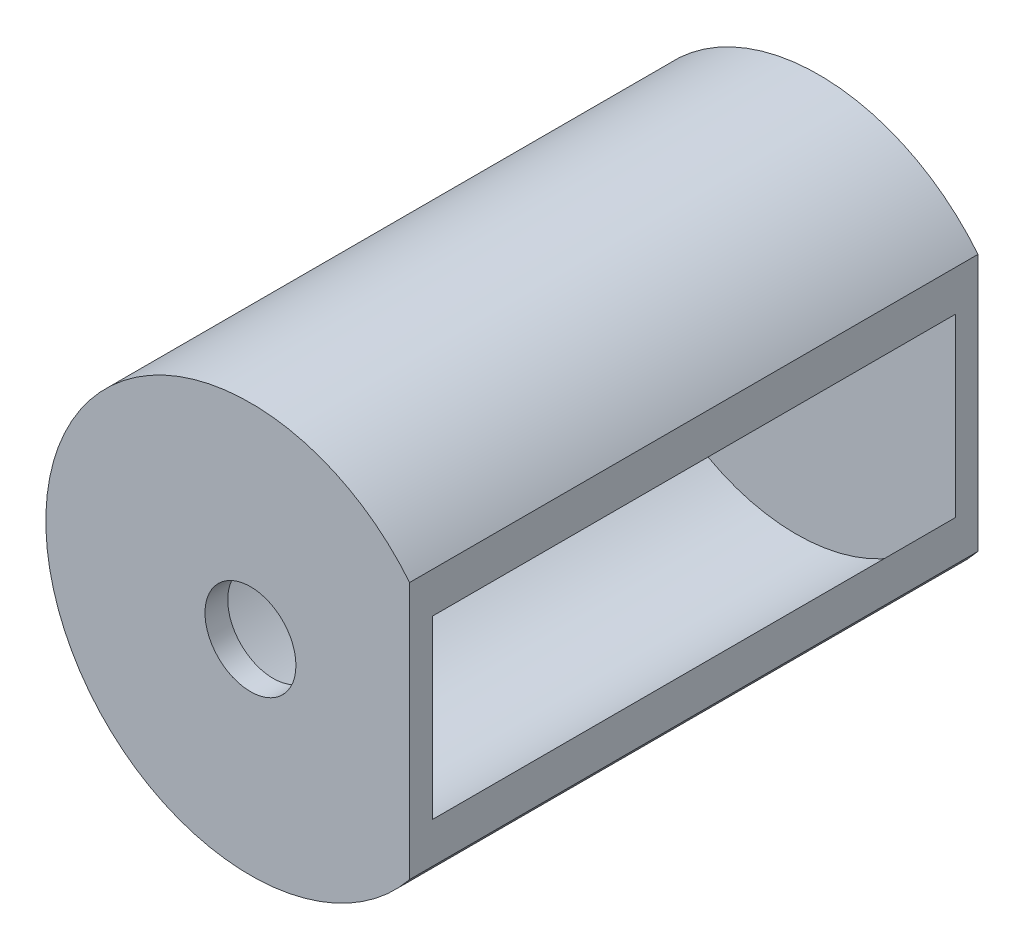
ISO-10303-21;
HEADER;
FILE_DESCRIPTION(('STEP AP214'),'2;1');
FILE_NAME('part.step','',(''),(''),'','','');
FILE_SCHEMA(('AUTOMOTIVE_DESIGN { 1 0 10303 214 1 1 1 1 }'));
ENDSEC;
DATA;
#1=APPLICATION_CONTEXT('core data for automotive mechanical design processes');
#2=APPLICATION_PROTOCOL_DEFINITION('international standard','automotive_design',2000,#1);
#3=PRODUCT_CONTEXT('',#1,'mechanical');
#4=PRODUCT('Part','Part','',(#3));
#5=PRODUCT_RELATED_PRODUCT_CATEGORY('part','',(#4));
#6=PRODUCT_DEFINITION_FORMATION('','',#4);
#7=PRODUCT_DEFINITION_CONTEXT('part definition',#1,'design');
#8=PRODUCT_DEFINITION('design','',#6,#7);
#9=PRODUCT_DEFINITION_SHAPE('','',#8);
#10=(LENGTH_UNIT() NAMED_UNIT(*) SI_UNIT(.MILLI.,.METRE.));
#11=(NAMED_UNIT(*) PLANE_ANGLE_UNIT() SI_UNIT($,.RADIAN.));
#12=(NAMED_UNIT(*) SI_UNIT($,.STERADIAN.) SOLID_ANGLE_UNIT());
#13=UNCERTAINTY_MEASURE_WITH_UNIT(LENGTH_MEASURE(1.E-05),#10,'distance_accuracy_value','');
#14=(GEOMETRIC_REPRESENTATION_CONTEXT(3) GLOBAL_UNCERTAINTY_ASSIGNED_CONTEXT((#13)) GLOBAL_UNIT_ASSIGNED_CONTEXT((#10,
#11,#12)) REPRESENTATION_CONTEXT('',''));
#15=CARTESIAN_POINT('',(0.,0.,0.));
#16=DIRECTION('',(0.,0.,1.));
#17=DIRECTION('',(1.,0.,0.));
#18=AXIS2_PLACEMENT_3D('',#15,#16,#17);
#19=CARTESIAN_POINT('',(0.,0.,50.));
#20=DIRECTION('',(0.,0.,1.));
#21=DIRECTION('',(1.,0.,0.));
#22=AXIS2_PLACEMENT_3D('',#19,#20,#21);
#23=PLANE('',#22);
#24=CARTESIAN_POINT('',(0.,0.,50.));
#25=DIRECTION('',(0.,0.,1.));
#26=DIRECTION('',(1.,0.,0.));
#27=AXIS2_PLACEMENT_3D('',#24,#25,#26);
#28=CIRCLE('',#27,4.);
#29=CARTESIAN_POINT('',(4.,0.,50.));
#30=VERTEX_POINT('',#29);
#31=EDGE_CURVE('E98',#30,#30,#28,.T.);
#32=ORIENTED_EDGE('',*,*,#31,.F.);
#33=EDGE_LOOP('',(#32));
#34=FACE_BOUND('',#33,.T.);
#35=DIRECTION('',(0.,-1.,0.));
#36=VECTOR('',#35,1.);
#37=CARTESIAN_POINT('',(14.,18.,50.));
#38=LINE('',#37,#36);
#39=CARTESIAN_POINT('',(14.,11.3137084989848,50.));
#40=VERTEX_POINT('',#39);
#41=CARTESIAN_POINT('',(14.,-11.3137084989848,50.));
#42=VERTEX_POINT('',#41);
#43=EDGE_CURVE('E60',#40,#42,#38,.T.);
#44=ORIENTED_EDGE('',*,*,#43,.F.);
#45=CARTESIAN_POINT('',(0.,0.,50.));
#46=DIRECTION('',(0.,0.,1.));
#47=DIRECTION('',(1.,0.,0.));
#48=AXIS2_PLACEMENT_3D('',#45,#46,#47);
#49=CIRCLE('',#48,18.);
#50=EDGE_CURVE('E53',#40,#42,#49,.T.);
#51=ORIENTED_EDGE('',*,*,#50,.T.);
#52=EDGE_LOOP('',(#44,#51));
#53=FACE_BOUND('',#52,.T.);
#54=ADVANCED_FACE('F44',(#34,#53),#23,.T.);
#55=CARTESIAN_POINT('',(0.,0.,0.));
#56=DIRECTION('',(0.,0.,1.));
#57=DIRECTION('',(1.,0.,0.));
#58=AXIS2_PLACEMENT_3D('',#55,#56,#57);
#59=PLANE('',#58);
#60=CARTESIAN_POINT('',(0.,0.,0.));
#61=DIRECTION('',(0.,0.,1.));
#62=DIRECTION('',(1.,0.,0.));
#63=AXIS2_PLACEMENT_3D('',#60,#61,#62);
#64=CIRCLE('',#63,4.);
#65=CARTESIAN_POINT('',(4.,0.,0.));
#66=VERTEX_POINT('',#65);
#67=EDGE_CURVE('E121',#66,#66,#64,.T.);
#68=ORIENTED_EDGE('',*,*,#67,.T.);
#69=EDGE_LOOP('',(#68));
#70=FACE_BOUND('',#69,.T.);
#71=CARTESIAN_POINT('',(0.,0.,0.));
#72=DIRECTION('',(0.,0.,1.));
#73=DIRECTION('',(1.,0.,0.));
#74=AXIS2_PLACEMENT_3D('',#71,#72,#73);
#75=CIRCLE('',#74,18.);
#76=CARTESIAN_POINT('',(14.,11.3137084989848,0.));
#77=VERTEX_POINT('',#76);
#78=CARTESIAN_POINT('',(14.,-11.3137084989848,0.));
#79=VERTEX_POINT('',#78);
#80=EDGE_CURVE('E97',#77,#79,#75,.T.);
#81=ORIENTED_EDGE('',*,*,#80,.F.);
#82=DIRECTION('',(0.,1.,0.));
#83=VECTOR('',#82,1.);
#84=CARTESIAN_POINT('',(14.,18.,0.));
#85=LINE('',#84,#83);
#86=EDGE_CURVE('E85',#79,#77,#85,.T.);
#87=ORIENTED_EDGE('',*,*,#86,.F.);
#88=EDGE_LOOP('',(#81,#87));
#89=FACE_BOUND('',#88,.T.);
#90=ADVANCED_FACE('F96',(#70,#89),#59,.F.);
#91=CARTESIAN_POINT('',(0.,0.,50.));
#92=DIRECTION('',(0.,0.,-1.));
#93=DIRECTION('',(-1.,0.,0.));
#94=AXIS2_PLACEMENT_3D('',#91,#92,#93);
#95=CYLINDRICAL_SURFACE('',#94,18.);
#96=ORIENTED_EDGE('',*,*,#50,.F.);
#97=DIRECTION('',(0.,0.,-1.));
#98=VECTOR('',#97,1.);
#99=CARTESIAN_POINT('',(14.,11.3137084989848,50.));
#100=LINE('',#99,#98);
#101=EDGE_CURVE('E91',#40,#77,#100,.T.);
#102=ORIENTED_EDGE('',*,*,#101,.T.);
#103=ORIENTED_EDGE('',*,*,#80,.T.);
#104=DIRECTION('',(0.,0.,-1.));
#105=VECTOR('',#104,1.);
#106=CARTESIAN_POINT('',(14.,-11.3137084989848,50.));
#107=LINE('',#106,#105);
#108=EDGE_CURVE('E82',#79,#42,#107,.F.);
#109=ORIENTED_EDGE('',*,*,#108,.T.);
#110=EDGE_LOOP('',(#96,#102,#103,#109));
#111=FACE_BOUND('',#110,.T.);
#112=ADVANCED_FACE('F46',(#111),#95,.T.);
#113=CARTESIAN_POINT('',(14.,0.,0.));
#114=DIRECTION('',(-1.,0.,0.));
#115=DIRECTION('',(0.,0.,1.));
#116=AXIS2_PLACEMENT_3D('',#113,#114,#115);
#117=PLANE('',#116);
#118=DIRECTION('',(0.,0.,-1.));
#119=VECTOR('',#118,1.);
#120=CARTESIAN_POINT('',(14.,-7.74596669241483,50.));
#121=LINE('',#120,#119);
#122=CARTESIAN_POINT('',(14.,-7.74596669241483,2.));
#123=VERTEX_POINT('',#122);
#124=CARTESIAN_POINT('',(14.,-7.74596669241483,48.));
#125=VERTEX_POINT('',#124);
#126=EDGE_CURVE('E68',#123,#125,#121,.F.);
#127=ORIENTED_EDGE('',*,*,#126,.T.);
#128=DIRECTION('',(0.,-1.,0.));
#129=VECTOR('',#128,1.);
#130=CARTESIAN_POINT('',(14.,0.,48.));
#131=LINE('',#130,#129);
#132=CARTESIAN_POINT('',(14.,7.74596669241483,48.));
#133=VERTEX_POINT('',#132);
#134=EDGE_CURVE('E13',#133,#125,#131,.T.);
#135=ORIENTED_EDGE('',*,*,#134,.F.);
#136=DIRECTION('',(0.,0.,-1.));
#137=VECTOR('',#136,1.);
#138=CARTESIAN_POINT('',(14.,7.74596669241483,50.));
#139=LINE('',#138,#137);
#140=CARTESIAN_POINT('',(14.,7.74596669241483,2.));
#141=VERTEX_POINT('',#140);
#142=EDGE_CURVE('E112',#133,#141,#139,.T.);
#143=ORIENTED_EDGE('',*,*,#142,.T.);
#144=DIRECTION('',(0.,1.,0.));
#145=VECTOR('',#144,1.);
#146=CARTESIAN_POINT('',(14.,0.,2.));
#147=LINE('',#146,#145);
#148=EDGE_CURVE('E92',#123,#141,#147,.T.);
#149=ORIENTED_EDGE('',*,*,#148,.F.);
#150=EDGE_LOOP('',(#127,#135,#143,#149));
#151=FACE_BOUND('',#150,.T.);
#152=ORIENTED_EDGE('',*,*,#43,.T.);
#153=ORIENTED_EDGE('',*,*,#108,.F.);
#154=ORIENTED_EDGE('',*,*,#86,.T.);
#155=ORIENTED_EDGE('',*,*,#101,.F.);
#156=EDGE_LOOP('',(#152,#153,#154,#155));
#157=FACE_BOUND('',#156,.T.);
#158=ADVANCED_FACE('F84',(#151,#157),#117,.F.);
#159=CARTESIAN_POINT('',(0.,0.,2.));
#160=DIRECTION('',(0.,0.,-1.));
#161=DIRECTION('',(-1.,0.,0.));
#162=AXIS2_PLACEMENT_3D('',#159,#160,#161);
#163=PLANE('',#162);
#164=CARTESIAN_POINT('',(0.,0.,2.));
#165=DIRECTION('',(0.,0.,-1.));
#166=DIRECTION('',(-1.,0.,0.));
#167=AXIS2_PLACEMENT_3D('',#164,#165,#166);
#168=CIRCLE('',#167,4.);
#169=CARTESIAN_POINT('',(-4.,0.,2.));
#170=VERTEX_POINT('',#169);
#171=EDGE_CURVE('E118',#170,#170,#168,.T.);
#172=ORIENTED_EDGE('',*,*,#171,.T.);
#173=EDGE_LOOP('',(#172));
#174=FACE_BOUND('',#173,.T.);
#175=CARTESIAN_POINT('',(0.,0.,2.));
#176=DIRECTION('',(0.,0.,-1.));
#177=DIRECTION('',(-1.,0.,0.));
#178=AXIS2_PLACEMENT_3D('',#175,#176,#177);
#179=CIRCLE('',#178,16.);
#180=EDGE_CURVE('E100',#123,#141,#179,.T.);
#181=ORIENTED_EDGE('',*,*,#180,.F.);
#182=ORIENTED_EDGE('',*,*,#148,.T.);
#183=EDGE_LOOP('',(#181,#182));
#184=FACE_BOUND('',#183,.T.);
#185=ADVANCED_FACE('F157',(#174,#184),#163,.F.);
#186=CARTESIAN_POINT('',(0.,0.,50.));
#187=DIRECTION('',(0.,0.,-1.));
#188=DIRECTION('',(-1.,0.,0.));
#189=AXIS2_PLACEMENT_3D('',#186,#187,#188);
#190=CYLINDRICAL_SURFACE('',#189,16.);
#191=ORIENTED_EDGE('',*,*,#142,.F.);
#192=CARTESIAN_POINT('',(0.,0.,48.));
#193=DIRECTION('',(0.,0.,1.));
#194=DIRECTION('',(1.,0.,0.));
#195=AXIS2_PLACEMENT_3D('',#192,#193,#194);
#196=CIRCLE('',#195,16.);
#197=EDGE_CURVE('E104',#133,#125,#196,.T.);
#198=ORIENTED_EDGE('',*,*,#197,.T.);
#199=ORIENTED_EDGE('',*,*,#126,.F.);
#200=ORIENTED_EDGE('',*,*,#180,.T.);
#201=EDGE_LOOP('',(#191,#198,#199,#200));
#202=FACE_BOUND('',#201,.T.);
#203=ADVANCED_FACE('F142',(#202),#190,.F.);
#204=CARTESIAN_POINT('',(0.,0.,48.));
#205=DIRECTION('',(0.,0.,1.));
#206=DIRECTION('',(1.,0.,0.));
#207=AXIS2_PLACEMENT_3D('',#204,#205,#206);
#208=PLANE('',#207);
#209=CARTESIAN_POINT('',(0.,0.,48.));
#210=DIRECTION('',(0.,0.,1.));
#211=DIRECTION('',(1.,0.,0.));
#212=AXIS2_PLACEMENT_3D('',#209,#210,#211);
#213=CIRCLE('',#212,4.);
#214=CARTESIAN_POINT('',(4.,0.,48.));
#215=VERTEX_POINT('',#214);
#216=EDGE_CURVE('E48',#215,#215,#213,.T.);
#217=ORIENTED_EDGE('',*,*,#216,.T.);
#218=EDGE_LOOP('',(#217));
#219=FACE_BOUND('',#218,.T.);
#220=ORIENTED_EDGE('',*,*,#197,.F.);
#221=ORIENTED_EDGE('',*,*,#134,.T.);
#222=EDGE_LOOP('',(#220,#221));
#223=FACE_BOUND('',#222,.T.);
#224=ADVANCED_FACE('F128',(#219,#223),#208,.F.);
#225=CARTESIAN_POINT('',(0.,0.,0.));
#226=DIRECTION('',(0.,0.,1.));
#227=DIRECTION('',(1.,0.,0.));
#228=AXIS2_PLACEMENT_3D('',#225,#226,#227);
#229=CYLINDRICAL_SURFACE('',#228,4.);
#230=ORIENTED_EDGE('',*,*,#31,.T.);
#231=EDGE_LOOP('',(#230));
#232=FACE_BOUND('',#231,.T.);
#233=ORIENTED_EDGE('',*,*,#216,.F.);
#234=EDGE_LOOP('',(#233));
#235=FACE_BOUND('',#234,.T.);
#236=ADVANCED_FACE('F131',(#232,#235),#229,.F.);
#237=ORIENTED_EDGE('',*,*,#67,.F.);
#238=EDGE_LOOP('',(#237));
#239=FACE_BOUND('',#238,.T.);
#240=ORIENTED_EDGE('',*,*,#171,.F.);
#241=EDGE_LOOP('',(#240));
#242=FACE_BOUND('',#241,.T.);
#243=ADVANCED_FACE('F133',(#239,#242),#229,.F.);
#244=CLOSED_SHELL('',(#54,#90,#112,#158,#185,#203,#224,#236,#243));
#245=MANIFOLD_SOLID_BREP('B2',#244);
#246=ADVANCED_BREP_SHAPE_REPRESENTATION('',(#18,#245),#14);
#247=SHAPE_DEFINITION_REPRESENTATION(#9,#246);
ENDSEC;
END-ISO-10303-21;
